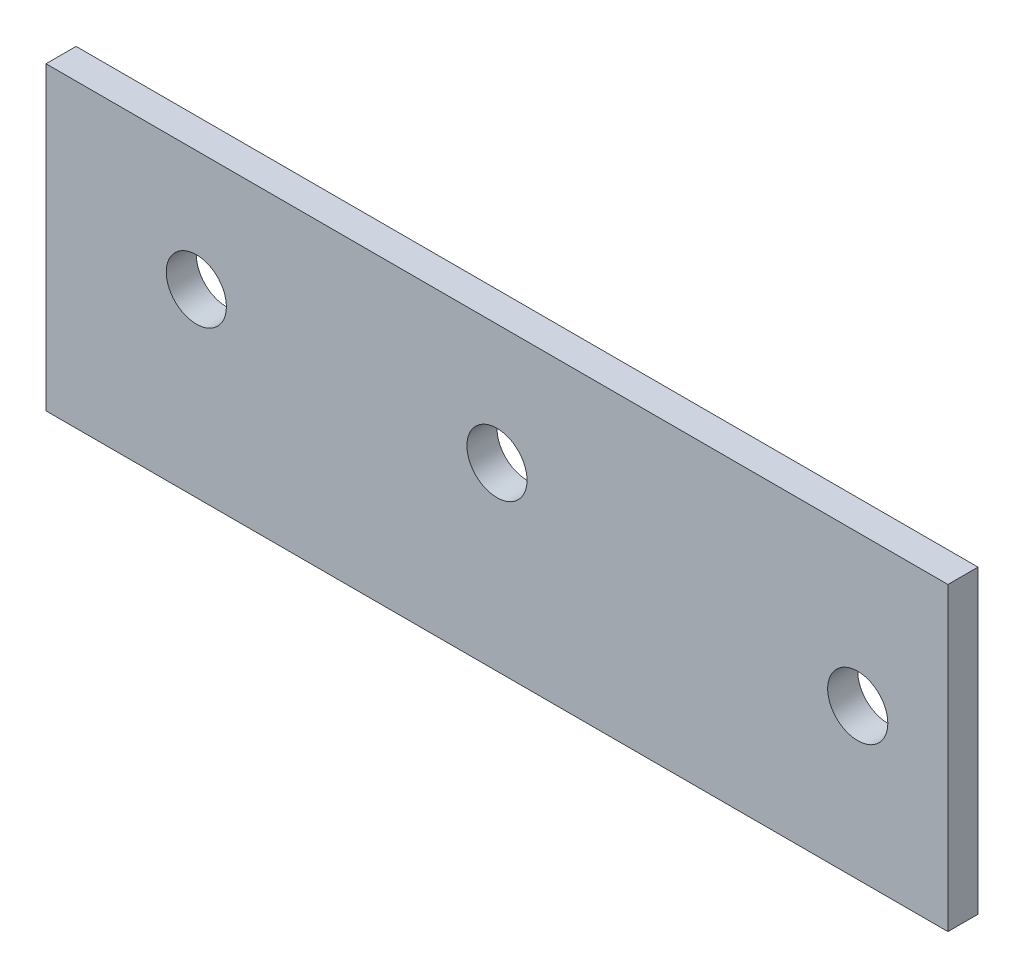
ISO-10303-21;
HEADER;
FILE_DESCRIPTION(('STEP AP214'),'2;1');
FILE_NAME('part.step','',(''),(''),'','','');
FILE_SCHEMA(('AUTOMOTIVE_DESIGN { 1 0 10303 214 1 1 1 1 }'));
ENDSEC;
DATA;
#1=APPLICATION_CONTEXT('core data for automotive mechanical design processes');
#2=APPLICATION_PROTOCOL_DEFINITION('international standard','automotive_design',2000,#1);
#3=PRODUCT_CONTEXT('',#1,'mechanical');
#4=PRODUCT('Part','Part','',(#3));
#5=PRODUCT_RELATED_PRODUCT_CATEGORY('part','',(#4));
#6=PRODUCT_DEFINITION_FORMATION('','',#4);
#7=PRODUCT_DEFINITION_CONTEXT('part definition',#1,'design');
#8=PRODUCT_DEFINITION('design','',#6,#7);
#9=PRODUCT_DEFINITION_SHAPE('','',#8);
#10=(LENGTH_UNIT() NAMED_UNIT(*) SI_UNIT(.MILLI.,.METRE.));
#11=(NAMED_UNIT(*) PLANE_ANGLE_UNIT() SI_UNIT($,.RADIAN.));
#12=(NAMED_UNIT(*) SI_UNIT($,.STERADIAN.) SOLID_ANGLE_UNIT());
#13=UNCERTAINTY_MEASURE_WITH_UNIT(LENGTH_MEASURE(1.E-05),#10,'distance_accuracy_value','');
#14=(GEOMETRIC_REPRESENTATION_CONTEXT(3) GLOBAL_UNCERTAINTY_ASSIGNED_CONTEXT((#13)) GLOBAL_UNIT_ASSIGNED_CONTEXT((#10,
#11,#12)) REPRESENTATION_CONTEXT('',''));
#15=CARTESIAN_POINT('',(0.,0.,0.));
#16=DIRECTION('',(0.,0.,1.));
#17=DIRECTION('',(1.,0.,0.));
#18=AXIS2_PLACEMENT_3D('',#15,#16,#17);
#19=CARTESIAN_POINT('',(543.591325712128,1873.08948896079,1.5));
#20=DIRECTION('',(0.,0.,-1.));
#21=DIRECTION('',(-1.,0.,0.));
#22=AXIS2_PLACEMENT_3D('',#19,#20,#21);
#23=PLANE('',#22);
#24=CARTESIAN_POINT('',(539.091325712128,1880.58948896079,1.5));
#25=DIRECTION('',(0.,0.,1.));
#26=DIRECTION('',(1.,0.,0.));
#27=AXIS2_PLACEMENT_3D('',#24,#25,#26);
#28=CIRCLE('',#27,1.49999999999994);
#29=CARTESIAN_POINT('',(540.591325712128,1880.58948896079,1.5));
#30=VERTEX_POINT('',#29);
#31=EDGE_CURVE('E113',#30,#30,#28,.T.);
#32=ORIENTED_EDGE('',*,*,#31,.F.);
#33=EDGE_LOOP('',(#32));
#34=FACE_BOUND('',#33,.T.);
#35=DIRECTION('',(0.,1.,0.));
#36=VECTOR('',#35,1.);
#37=CARTESIAN_POINT('',(543.591325712128,1888.08948896079,1.5));
#38=LINE('',#37,#36);
#39=CARTESIAN_POINT('',(543.591325712128,1873.08948896079,1.5));
#40=VERTEX_POINT('',#39);
#41=CARTESIAN_POINT('',(543.591325712128,1888.08948896079,1.5));
#42=VERTEX_POINT('',#41);
#43=EDGE_CURVE('E83',#40,#42,#38,.T.);
#44=ORIENTED_EDGE('',*,*,#43,.T.);
#45=DIRECTION('',(-1.,0.,0.));
#46=VECTOR('',#45,1.);
#47=CARTESIAN_POINT('',(543.591325712128,1888.08948896079,1.5));
#48=LINE('',#47,#46);
#49=CARTESIAN_POINT('',(498.591325712128,1888.08948896079,1.5));
#50=VERTEX_POINT('',#49);
#51=EDGE_CURVE('E78',#42,#50,#48,.T.);
#52=ORIENTED_EDGE('',*,*,#51,.T.);
#53=DIRECTION('',(0.,-1.,0.));
#54=VECTOR('',#53,1.);
#55=CARTESIAN_POINT('',(498.591325712128,1888.08948896079,1.5));
#56=LINE('',#55,#54);
#57=CARTESIAN_POINT('',(498.591325712128,1873.08948896079,1.5));
#58=VERTEX_POINT('',#57);
#59=EDGE_CURVE('E81',#50,#58,#56,.T.);
#60=ORIENTED_EDGE('',*,*,#59,.T.);
#61=DIRECTION('',(1.,0.,0.));
#62=VECTOR('',#61,1.);
#63=CARTESIAN_POINT('',(543.591325712128,1873.08948896079,1.5));
#64=LINE('',#63,#62);
#65=EDGE_CURVE('E48',#58,#40,#64,.T.);
#66=ORIENTED_EDGE('',*,*,#65,.T.);
#67=EDGE_LOOP('',(#44,#52,#60,#66));
#68=FACE_BOUND('',#67,.T.);
#69=CARTESIAN_POINT('',(521.091325712128,1882.08948896079,1.5));
#70=DIRECTION('',(0.,0.,1.));
#71=DIRECTION('',(1.,0.,0.));
#72=AXIS2_PLACEMENT_3D('',#69,#70,#71);
#73=CIRCLE('',#72,1.49999999999994);
#74=CARTESIAN_POINT('',(522.591325712128,1882.08948896079,1.5));
#75=VERTEX_POINT('',#74);
#76=EDGE_CURVE('E98',#75,#75,#73,.T.);
#77=ORIENTED_EDGE('',*,*,#76,.F.);
#78=EDGE_LOOP('',(#77));
#79=FACE_BOUND('',#78,.T.);
#80=CARTESIAN_POINT('',(506.091325712128,1882.08948896079,1.5));
#81=DIRECTION('',(0.,0.,1.));
#82=DIRECTION('',(1.,0.,0.));
#83=AXIS2_PLACEMENT_3D('',#80,#81,#82);
#84=CIRCLE('',#83,1.49999999999994);
#85=CARTESIAN_POINT('',(507.591325712128,1882.08948896079,1.5));
#86=VERTEX_POINT('',#85);
#87=EDGE_CURVE('E119',#86,#86,#84,.T.);
#88=ORIENTED_EDGE('',*,*,#87,.F.);
#89=EDGE_LOOP('',(#88));
#90=FACE_BOUND('',#89,.T.);
#91=ADVANCED_FACE('F31',(#34,#68,#79,#90),#23,.F.);
#92=CARTESIAN_POINT('',(543.591325712128,1873.08948896079,0.));
#93=DIRECTION('',(0.,0.,-1.));
#94=DIRECTION('',(-1.,0.,0.));
#95=AXIS2_PLACEMENT_3D('',#92,#93,#94);
#96=PLANE('',#95);
#97=CARTESIAN_POINT('',(539.091325712128,1880.58948896079,0.));
#98=DIRECTION('',(0.,0.,1.));
#99=DIRECTION('',(1.,0.,0.));
#100=AXIS2_PLACEMENT_3D('',#97,#98,#99);
#101=CIRCLE('',#100,1.49999999999994);
#102=CARTESIAN_POINT('',(540.591325712128,1880.58948896079,0.));
#103=VERTEX_POINT('',#102);
#104=EDGE_CURVE('E116',#103,#103,#101,.T.);
#105=ORIENTED_EDGE('',*,*,#104,.T.);
#106=EDGE_LOOP('',(#105));
#107=FACE_BOUND('',#106,.T.);
#108=DIRECTION('',(0.,1.,0.));
#109=VECTOR('',#108,1.);
#110=CARTESIAN_POINT('',(543.591325712128,1888.08948896079,0.));
#111=LINE('',#110,#109);
#112=CARTESIAN_POINT('',(543.591325712128,1873.08948896079,0.));
#113=VERTEX_POINT('',#112);
#114=CARTESIAN_POINT('',(543.591325712128,1888.08948896079,0.));
#115=VERTEX_POINT('',#114);
#116=EDGE_CURVE('E95',#113,#115,#111,.T.);
#117=ORIENTED_EDGE('',*,*,#116,.F.);
#118=DIRECTION('',(1.,0.,0.));
#119=VECTOR('',#118,1.);
#120=CARTESIAN_POINT('',(543.591325712128,1873.08948896079,0.));
#121=LINE('',#120,#119);
#122=CARTESIAN_POINT('',(498.591325712128,1873.08948896079,0.));
#123=VERTEX_POINT('',#122);
#124=EDGE_CURVE('E71',#123,#113,#121,.T.);
#125=ORIENTED_EDGE('',*,*,#124,.F.);
#126=DIRECTION('',(0.,-1.,0.));
#127=VECTOR('',#126,1.);
#128=CARTESIAN_POINT('',(498.591325712128,1888.08948896079,0.));
#129=LINE('',#128,#127);
#130=CARTESIAN_POINT('',(498.591325712128,1888.08948896079,0.));
#131=VERTEX_POINT('',#130);
#132=EDGE_CURVE('E65',#131,#123,#129,.T.);
#133=ORIENTED_EDGE('',*,*,#132,.F.);
#134=DIRECTION('',(-1.,0.,0.));
#135=VECTOR('',#134,1.);
#136=CARTESIAN_POINT('',(543.591325712128,1888.08948896079,0.));
#137=LINE('',#136,#135);
#138=EDGE_CURVE('E87',#115,#131,#137,.T.);
#139=ORIENTED_EDGE('',*,*,#138,.F.);
#140=EDGE_LOOP('',(#117,#125,#133,#139));
#141=FACE_BOUND('',#140,.T.);
#142=CARTESIAN_POINT('',(521.091325712128,1882.08948896079,0.));
#143=DIRECTION('',(0.,0.,1.));
#144=DIRECTION('',(1.,0.,0.));
#145=AXIS2_PLACEMENT_3D('',#142,#143,#144);
#146=CIRCLE('',#145,1.49999999999994);
#147=CARTESIAN_POINT('',(522.591325712128,1882.08948896079,0.));
#148=VERTEX_POINT('',#147);
#149=EDGE_CURVE('E110',#148,#148,#146,.T.);
#150=ORIENTED_EDGE('',*,*,#149,.T.);
#151=EDGE_LOOP('',(#150));
#152=FACE_BOUND('',#151,.T.);
#153=CARTESIAN_POINT('',(506.091325712128,1882.08948896079,0.));
#154=DIRECTION('',(0.,0.,1.));
#155=DIRECTION('',(1.,0.,0.));
#156=AXIS2_PLACEMENT_3D('',#153,#154,#155);
#157=CIRCLE('',#156,1.49999999999994);
#158=CARTESIAN_POINT('',(507.591325712128,1882.08948896079,0.));
#159=VERTEX_POINT('',#158);
#160=EDGE_CURVE('E122',#159,#159,#157,.T.);
#161=ORIENTED_EDGE('',*,*,#160,.T.);
#162=EDGE_LOOP('',(#161));
#163=FACE_BOUND('',#162,.T.);
#164=ADVANCED_FACE('F106',(#107,#141,#152,#163),#96,.T.);
#165=CARTESIAN_POINT('',(543.591325712128,1888.08948896079,1.5));
#166=DIRECTION('',(-1.,0.,0.));
#167=DIRECTION('',(0.,0.,1.));
#168=AXIS2_PLACEMENT_3D('',#165,#166,#167);
#169=PLANE('',#168);
#170=ORIENTED_EDGE('',*,*,#116,.T.);
#171=DIRECTION('',(0.,0.,-1.));
#172=VECTOR('',#171,1.);
#173=CARTESIAN_POINT('',(543.591325712128,1888.08948896079,1.5));
#174=LINE('',#173,#172);
#175=EDGE_CURVE('E11',#42,#115,#174,.T.);
#176=ORIENTED_EDGE('',*,*,#175,.F.);
#177=ORIENTED_EDGE('',*,*,#43,.F.);
#178=DIRECTION('',(0.,0.,-1.));
#179=VECTOR('',#178,1.);
#180=CARTESIAN_POINT('',(543.591325712128,1873.08948896079,1.5));
#181=LINE('',#180,#179);
#182=EDGE_CURVE('E91',#40,#113,#181,.T.);
#183=ORIENTED_EDGE('',*,*,#182,.T.);
#184=EDGE_LOOP('',(#170,#176,#177,#183));
#185=FACE_BOUND('',#184,.T.);
#186=ADVANCED_FACE('F33',(#185),#169,.F.);
#187=CARTESIAN_POINT('',(543.591325712128,1888.08948896079,1.5));
#188=DIRECTION('',(0.,-1.,0.));
#189=DIRECTION('',(0.,0.,-1.));
#190=AXIS2_PLACEMENT_3D('',#187,#188,#189);
#191=PLANE('',#190);
#192=ORIENTED_EDGE('',*,*,#138,.T.);
#193=DIRECTION('',(0.,0.,-1.));
#194=VECTOR('',#193,1.);
#195=CARTESIAN_POINT('',(498.591325712128,1888.08948896079,1.5));
#196=LINE('',#195,#194);
#197=EDGE_CURVE('E40',#50,#131,#196,.T.);
#198=ORIENTED_EDGE('',*,*,#197,.F.);
#199=ORIENTED_EDGE('',*,*,#51,.F.);
#200=ORIENTED_EDGE('',*,*,#175,.T.);
#201=EDGE_LOOP('',(#192,#198,#199,#200));
#202=FACE_BOUND('',#201,.T.);
#203=ADVANCED_FACE('F86',(#202),#191,.F.);
#204=CARTESIAN_POINT('',(498.591325712128,1888.08948896079,1.5));
#205=DIRECTION('',(1.,0.,0.));
#206=DIRECTION('',(0.,0.,-1.));
#207=AXIS2_PLACEMENT_3D('',#204,#205,#206);
#208=PLANE('',#207);
#209=ORIENTED_EDGE('',*,*,#132,.T.);
#210=DIRECTION('',(0.,0.,-1.));
#211=VECTOR('',#210,1.);
#212=CARTESIAN_POINT('',(498.591325712128,1873.08948896079,1.5));
#213=LINE('',#212,#211);
#214=EDGE_CURVE('E88',#58,#123,#213,.T.);
#215=ORIENTED_EDGE('',*,*,#214,.F.);
#216=ORIENTED_EDGE('',*,*,#59,.F.);
#217=ORIENTED_EDGE('',*,*,#197,.T.);
#218=EDGE_LOOP('',(#209,#215,#216,#217));
#219=FACE_BOUND('',#218,.T.);
#220=ADVANCED_FACE('F89',(#219),#208,.F.);
#221=CARTESIAN_POINT('',(543.591325712128,1873.08948896079,1.5));
#222=DIRECTION('',(0.,1.,0.));
#223=DIRECTION('',(0.,0.,1.));
#224=AXIS2_PLACEMENT_3D('',#221,#222,#223);
#225=PLANE('',#224);
#226=ORIENTED_EDGE('',*,*,#124,.T.);
#227=ORIENTED_EDGE('',*,*,#182,.F.);
#228=ORIENTED_EDGE('',*,*,#65,.F.);
#229=ORIENTED_EDGE('',*,*,#214,.T.);
#230=EDGE_LOOP('',(#226,#227,#228,#229));
#231=FACE_BOUND('',#230,.T.);
#232=ADVANCED_FACE('F103',(#231),#225,.F.);
#233=CARTESIAN_POINT('',(521.091325712128,1882.08948896079,1.5));
#234=DIRECTION('',(0.,0.,-1.));
#235=DIRECTION('',(-1.,0.,0.));
#236=AXIS2_PLACEMENT_3D('',#233,#234,#235);
#237=CYLINDRICAL_SURFACE('',#236,1.49999999999994);
#238=ORIENTED_EDGE('',*,*,#76,.T.);
#239=EDGE_LOOP('',(#238));
#240=FACE_BOUND('',#239,.T.);
#241=ORIENTED_EDGE('',*,*,#149,.F.);
#242=EDGE_LOOP('',(#241));
#243=FACE_BOUND('',#242,.T.);
#244=ADVANCED_FACE('F141',(#240,#243),#237,.F.);
#245=CARTESIAN_POINT('',(539.091325712128,1880.58948896079,1.5));
#246=DIRECTION('',(0.,0.,-1.));
#247=DIRECTION('',(-1.,0.,0.));
#248=AXIS2_PLACEMENT_3D('',#245,#246,#247);
#249=CYLINDRICAL_SURFACE('',#248,1.49999999999994);
#250=ORIENTED_EDGE('',*,*,#31,.T.);
#251=EDGE_LOOP('',(#250));
#252=FACE_BOUND('',#251,.T.);
#253=ORIENTED_EDGE('',*,*,#104,.F.);
#254=EDGE_LOOP('',(#253));
#255=FACE_BOUND('',#254,.T.);
#256=ADVANCED_FACE('F187',(#252,#255),#249,.F.);
#257=CARTESIAN_POINT('',(506.091325712128,1882.08948896079,1.5));
#258=DIRECTION('',(0.,0.,-1.));
#259=DIRECTION('',(-1.,0.,0.));
#260=AXIS2_PLACEMENT_3D('',#257,#258,#259);
#261=CYLINDRICAL_SURFACE('',#260,1.49999999999994);
#262=ORIENTED_EDGE('',*,*,#87,.T.);
#263=EDGE_LOOP('',(#262));
#264=FACE_BOUND('',#263,.T.);
#265=ORIENTED_EDGE('',*,*,#160,.F.);
#266=EDGE_LOOP('',(#265));
#267=FACE_BOUND('',#266,.T.);
#268=ADVANCED_FACE('F128',(#264,#267),#261,.F.);
#269=CLOSED_SHELL('',(#91,#164,#186,#203,#220,#232,#244,#256,#268));
#270=MANIFOLD_SOLID_BREP('B2',#269);
#271=ADVANCED_BREP_SHAPE_REPRESENTATION('',(#18,#270),#14);
#272=SHAPE_DEFINITION_REPRESENTATION(#9,#271);
ENDSEC;
END-ISO-10303-21;
